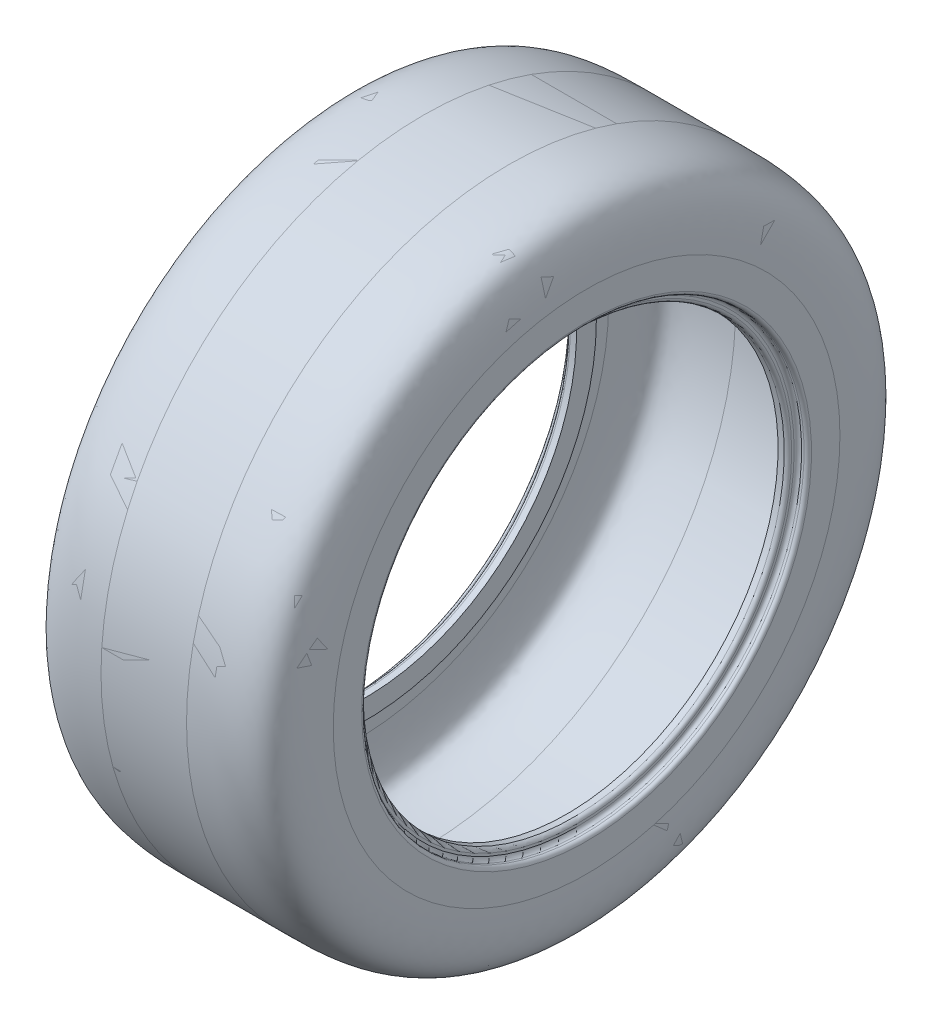
ISO-10303-21;
HEADER;
FILE_DESCRIPTION(('STEP AP214'),'2;1');
FILE_NAME('part.step','',(''),(''),'','','');
FILE_SCHEMA(('AUTOMOTIVE_DESIGN { 1 0 10303 214 1 1 1 1 }'));
ENDSEC;
DATA;
#1=APPLICATION_CONTEXT('core data for automotive mechanical design processes');
#2=APPLICATION_PROTOCOL_DEFINITION('international standard','automotive_design',2000,#1);
#3=PRODUCT_CONTEXT('',#1,'mechanical');
#4=PRODUCT('Part','Part','',(#3));
#5=PRODUCT_RELATED_PRODUCT_CATEGORY('part','',(#4));
#6=PRODUCT_DEFINITION_FORMATION('','',#4);
#7=PRODUCT_DEFINITION_CONTEXT('part definition',#1,'design');
#8=PRODUCT_DEFINITION('design','',#6,#7);
#9=PRODUCT_DEFINITION_SHAPE('','',#8);
#10=(LENGTH_UNIT() NAMED_UNIT(*) SI_UNIT(.MILLI.,.METRE.));
#11=(NAMED_UNIT(*) PLANE_ANGLE_UNIT() SI_UNIT($,.RADIAN.));
#12=(NAMED_UNIT(*) SI_UNIT($,.STERADIAN.) SOLID_ANGLE_UNIT());
#13=UNCERTAINTY_MEASURE_WITH_UNIT(LENGTH_MEASURE(1.E-05),#10,'distance_accuracy_value','');
#14=(GEOMETRIC_REPRESENTATION_CONTEXT(3) GLOBAL_UNCERTAINTY_ASSIGNED_CONTEXT((#13)) GLOBAL_UNIT_ASSIGNED_CONTEXT((#10,
#11,#12)) REPRESENTATION_CONTEXT('',''));
#15=CARTESIAN_POINT('',(0.,0.,0.));
#16=DIRECTION('',(0.,0.,1.));
#17=DIRECTION('',(1.,0.,0.));
#18=AXIS2_PLACEMENT_3D('',#15,#16,#17);
#19=CARTESIAN_POINT('',(34.544,260.35,0.));
#20=CARTESIAN_POINT('',(54.2380362782699,260.35,0.));
#21=CARTESIAN_POINT('',(96.8436791256326,260.294718787176,0.));
#22=CARTESIAN_POINT('',(97.409,229.201245204171,0.));
#23=CARTESIAN_POINT('',(97.409,204.6732,0.));
#24=B_SPLINE_CURVE_WITH_KNOTS('',3,(#19,#20,#21,#22,#23),.UNSPECIFIED.,.F.,.F.,(4,1,4),(0.,
0.500439370212607,1.),.UNSPECIFIED.);
#25=CARTESIAN_POINT('',(120.106742895568,0.,0.));
#26=DIRECTION('',(1.,0.,0.));
#27=AXIS1_PLACEMENT('',#25,#26);
#28=SURFACE_OF_REVOLUTION('',#24,#27);
#29=CARTESIAN_POINT('',(97.409,0.,0.));
#30=DIRECTION('',(-1.,0.,0.));
#31=DIRECTION('',(0.,0.,1.));
#32=AXIS2_PLACEMENT_3D('',#29,#30,#31);
#33=CIRCLE('',#32,204.6732);
#34=CARTESIAN_POINT('',(97.409,0.,204.6732));
#35=VERTEX_POINT('',#34);
#36=EDGE_CURVE('E11',#35,#35,#33,.T.);
#37=ORIENTED_EDGE('',*,*,#36,.T.);
#38=EDGE_LOOP('',(#37));
#39=FACE_BOUND('',#38,.T.);
#40=CARTESIAN_POINT('',(34.544,0.,0.));
#41=DIRECTION('',(-1.,0.,0.));
#42=DIRECTION('',(0.,0.,1.));
#43=AXIS2_PLACEMENT_3D('',#40,#41,#42);
#44=CIRCLE('',#43,260.35);
#45=CARTESIAN_POINT('',(34.544,0.,260.35));
#46=VERTEX_POINT('',#45);
#47=EDGE_CURVE('E51',#46,#46,#44,.T.);
#48=ORIENTED_EDGE('',*,*,#47,.F.);
#49=EDGE_LOOP('',(#48));
#50=FACE_BOUND('',#49,.T.);
#51=ADVANCED_FACE('F45',(#39,#50),#28,.T.);
#52=CARTESIAN_POINT('',(-120.106742895568,0.,0.));
#53=DIRECTION('',(-1.,0.,0.));
#54=DIRECTION('',(0.,0.,1.));
#55=AXIS2_PLACEMENT_3D('',#52,#53,#54);
#56=CYLINDRICAL_SURFACE('',#55,260.35);
#57=CARTESIAN_POINT('',(-34.544,0.,0.));
#58=DIRECTION('',(-1.,0.,0.));
#59=DIRECTION('',(0.,0.,1.));
#60=AXIS2_PLACEMENT_3D('',#57,#58,#59);
#61=CIRCLE('',#60,260.35);
#62=CARTESIAN_POINT('',(-34.544,0.,260.35));
#63=VERTEX_POINT('',#62);
#64=EDGE_CURVE('E59',#63,#63,#61,.T.);
#65=ORIENTED_EDGE('',*,*,#64,.F.);
#66=EDGE_LOOP('',(#65));
#67=FACE_BOUND('',#66,.T.);
#68=ORIENTED_EDGE('',*,*,#47,.T.);
#69=EDGE_LOOP('',(#68));
#70=FACE_BOUND('',#69,.T.);
#71=ADVANCED_FACE('F86',(#67,#70),#56,.T.);
#72=CARTESIAN_POINT('',(-34.544,260.35,0.));
#73=CARTESIAN_POINT('',(-54.2380362782699,260.35,0.));
#74=CARTESIAN_POINT('',(-96.8436791256326,260.294718787176,0.));
#75=CARTESIAN_POINT('',(-97.409,229.201245204171,0.));
#76=CARTESIAN_POINT('',(-97.409,204.6732,0.));
#77=B_SPLINE_CURVE_WITH_KNOTS('',3,(#72,#73,#74,#75,#76),.UNSPECIFIED.,.F.,.F.,(4,1,4),(0.,
0.500439370212607,1.),.UNSPECIFIED.);
#78=CARTESIAN_POINT('',(-120.106742895568,0.,0.));
#79=DIRECTION('',(-1.,0.,0.));
#80=AXIS1_PLACEMENT('',#78,#79);
#81=SURFACE_OF_REVOLUTION('',#77,#80);
#82=CARTESIAN_POINT('',(-97.409,0.,0.));
#83=DIRECTION('',(-1.,0.,0.));
#84=DIRECTION('',(0.,0.,1.));
#85=AXIS2_PLACEMENT_3D('',#82,#83,#84);
#86=CIRCLE('',#85,204.6732);
#87=CARTESIAN_POINT('',(-97.409,0.,204.6732));
#88=VERTEX_POINT('',#87);
#89=EDGE_CURVE('E65',#88,#88,#86,.T.);
#90=ORIENTED_EDGE('',*,*,#89,.F.);
#91=EDGE_LOOP('',(#90));
#92=FACE_BOUND('',#91,.T.);
#93=ORIENTED_EDGE('',*,*,#64,.T.);
#94=EDGE_LOOP('',(#93));
#95=FACE_BOUND('',#94,.T.);
#96=ADVANCED_FACE('F84',(#92,#95),#81,.T.);
#97=OPEN_SHELL('',(#51,#71,#96));
#98=SHELL_BASED_SURFACE_MODEL('B2',(#97));
#99=CARTESIAN_POINT('',(-120.106742895568,0.,0.));
#100=DIRECTION('',(-1.,0.,0.));
#101=DIRECTION('',(0.,0.,1.));
#102=AXIS2_PLACEMENT_3D('',#99,#100,#101);
#103=CYLINDRICAL_SURFACE('',#102,252.349);
#104=CARTESIAN_POINT('',(-34.544,0.,0.));
#105=DIRECTION('',(-1.,0.,0.));
#106=DIRECTION('',(0.,0.,1.));
#107=AXIS2_PLACEMENT_3D('',#104,#105,#106);
#108=CIRCLE('',#107,252.349);
#109=CARTESIAN_POINT('',(-34.544,0.,252.349));
#110=VERTEX_POINT('',#109);
#111=EDGE_CURVE('E183',#110,#110,#108,.T.);
#112=ORIENTED_EDGE('',*,*,#111,.T.);
#113=EDGE_LOOP('',(#112));
#114=FACE_BOUND('',#113,.T.);
#115=CARTESIAN_POINT('',(34.544,0.,0.));
#116=DIRECTION('',(-1.,0.,0.));
#117=DIRECTION('',(0.,0.,1.));
#118=AXIS2_PLACEMENT_3D('',#115,#116,#117);
#119=CIRCLE('',#118,252.349);
#120=CARTESIAN_POINT('',(34.544,0.,252.349));
#121=VERTEX_POINT('',#120);
#122=EDGE_CURVE('E208',#121,#121,#119,.T.);
#123=ORIENTED_EDGE('',*,*,#122,.F.);
#124=EDGE_LOOP('',(#123));
#125=FACE_BOUND('',#124,.T.);
#126=ADVANCED_FACE('F129',(#114,#125),#103,.F.);
#127=CARTESIAN_POINT('',(-89.408,204.6732,0.));
#128=CARTESIAN_POINT('',(-89.408,205.428511481488,0.));
#129=CARTESIAN_POINT('',(-89.4074481294099,206.953602566111,0.));
#130=CARTESIAN_POINT('',(-89.4016722170661,209.888037484535,0.));
#131=CARTESIAN_POINT('',(-89.3811140265898,213.418121805844,0.));
#132=CARTESIAN_POINT('',(-89.3208009929498,217.405548766125,0.));
#133=CARTESIAN_POINT('',(-89.1749069460033,222.394259863428,0.));
#134=CARTESIAN_POINT('',(-88.8373919387541,227.999934294238,0.));
#135=CARTESIAN_POINT('',(-88.1026678709484,233.669585183806,0.));
#136=CARTESIAN_POINT('',(-87.0031069794399,238.226642631209,0.));
#137=CARTESIAN_POINT('',(-85.5795715018578,241.661292123052,0.));
#138=CARTESIAN_POINT('',(-83.9698243004832,244.024418961103,0.));
#139=CARTESIAN_POINT('',(-82.3680542692465,245.565614045219,0.));
#140=CARTESIAN_POINT('',(-80.6182199791964,246.772714256692,0.));
#141=CARTESIAN_POINT('',(-78.2236283903669,248.033037193223,0.));
#142=CARTESIAN_POINT('',(-74.4012841407882,249.412831370225,0.));
#143=CARTESIAN_POINT('',(-69.0966623406285,250.616677169545,0.));
#144=CARTESIAN_POINT('',(-60.9755730997374,251.743940548168,0.));
#145=CARTESIAN_POINT('',(-51.6939864079942,252.224589007201,0.));
#146=CARTESIAN_POINT('',(-41.9379015529832,252.347933269659,0.));
#147=CARTESIAN_POINT('',(-37.0039834879832,252.349,0.));
#148=CARTESIAN_POINT('',(-34.544,252.349,0.));
#149=B_SPLINE_CURVE_WITH_KNOTS('',3,(#127,#128,#129,#130,#131,#132,#133,#134,#135,#136,#137,
#138,#139,#140,#141,#142,#143,#144,#145,#146,#147,#148),.UNSPECIFIED.,.F.,.F.,(4,1,1,1,1,1,1,1,
1,1,1,1,1,1,1,1,1,1,1,4),(0.,0.015625,0.03125,0.0625,0.09375,0.125,0.1875,0.25,0.3125,0.375,
0.4375,0.490405543441297,0.521655543441297,0.5625,0.625,0.6875,0.75,0.875,0.9375,1.),.UNSPECIFIED.);
#150=CARTESIAN_POINT('',(-120.106742895568,0.,0.));
#151=DIRECTION('',(-1.,0.,0.));
#152=AXIS1_PLACEMENT('',#150,#151);
#153=SURFACE_OF_REVOLUTION('',#149,#152);
#154=ORIENTED_EDGE('',*,*,#111,.F.);
#155=EDGE_LOOP('',(#154));
#156=FACE_BOUND('',#155,.T.);
#157=CARTESIAN_POINT('',(-89.408,0.,0.));
#158=DIRECTION('',(-1.,0.,0.));
#159=DIRECTION('',(0.,0.,1.));
#160=AXIS2_PLACEMENT_3D('',#157,#158,#159);
#161=CIRCLE('',#160,204.6732);
#162=CARTESIAN_POINT('',(-89.408,0.,204.6732));
#163=VERTEX_POINT('',#162);
#164=EDGE_CURVE('E187',#163,#163,#161,.T.);
#165=ORIENTED_EDGE('',*,*,#164,.T.);
#166=EDGE_LOOP('',(#165));
#167=FACE_BOUND('',#166,.T.);
#168=ADVANCED_FACE('F221',(#156,#167),#153,.T.);
#169=CARTESIAN_POINT('',(-89.408,186.69,0.));
#170=DIRECTION('',(-1.,0.,0.));
#171=DIRECTION('',(0.,0.,1.));
#172=AXIS2_PLACEMENT_3D('',#169,#170,#171);
#173=PLANE('',#172);
#174=ORIENTED_EDGE('',*,*,#164,.F.);
#175=EDGE_LOOP('',(#174));
#176=FACE_BOUND('',#175,.T.);
#177=CARTESIAN_POINT('',(-89.408,0.,0.));
#178=DIRECTION('',(-1.,0.,0.));
#179=DIRECTION('',(0.,0.,1.));
#180=AXIS2_PLACEMENT_3D('',#177,#178,#179);
#181=CIRCLE('',#180,186.69);
#182=CARTESIAN_POINT('',(-89.408,0.,186.69));
#183=VERTEX_POINT('',#182);
#184=EDGE_CURVE('E191',#183,#183,#181,.T.);
#185=ORIENTED_EDGE('',*,*,#184,.T.);
#186=EDGE_LOOP('',(#185));
#187=FACE_BOUND('',#186,.T.);
#188=ADVANCED_FACE('F225',(#176,#187),#173,.F.);
#189=CARTESIAN_POINT('',(-120.106742895568,0.,0.));
#190=DIRECTION('',(-1.,0.,0.));
#191=DIRECTION('',(0.,0.,1.));
#192=AXIS2_PLACEMENT_3D('',#189,#190,#191);
#193=CYLINDRICAL_SURFACE('',#192,186.69);
#194=ORIENTED_EDGE('',*,*,#184,.F.);
#195=EDGE_LOOP('',(#194));
#196=FACE_BOUND('',#195,.T.);
#197=CARTESIAN_POINT('',(-81.407,0.,0.));
#198=DIRECTION('',(-1.,0.,0.));
#199=DIRECTION('',(0.,0.,1.));
#200=AXIS2_PLACEMENT_3D('',#197,#198,#199);
#201=CIRCLE('',#200,186.69);
#202=CARTESIAN_POINT('',(-81.407,0.,186.69));
#203=VERTEX_POINT('',#202);
#204=EDGE_CURVE('E194',#203,#203,#201,.T.);
#205=ORIENTED_EDGE('',*,*,#204,.T.);
#206=EDGE_LOOP('',(#205));
#207=FACE_BOUND('',#206,.T.);
#208=ADVANCED_FACE('F357',(#196,#207),#193,.T.);
#209=CARTESIAN_POINT('',(-81.407,178.689,0.));
#210=DIRECTION('',(-1.,0.,0.));
#211=DIRECTION('',(0.,0.,1.));
#212=AXIS2_PLACEMENT_3D('',#209,#210,#211);
#213=PLANE('',#212);
#214=ORIENTED_EDGE('',*,*,#204,.F.);
#215=EDGE_LOOP('',(#214));
#216=FACE_BOUND('',#215,.T.);
#217=CARTESIAN_POINT('',(-81.407,0.,0.));
#218=DIRECTION('',(-1.,0.,0.));
#219=DIRECTION('',(0.,0.,1.));
#220=AXIS2_PLACEMENT_3D('',#217,#218,#219);
#221=CIRCLE('',#220,170.688);
#222=CARTESIAN_POINT('',(-81.407,0.,170.688));
#223=VERTEX_POINT('',#222);
#224=EDGE_CURVE('E197',#223,#223,#221,.T.);
#225=ORIENTED_EDGE('',*,*,#224,.T.);
#226=EDGE_LOOP('',(#225));
#227=FACE_BOUND('',#226,.T.);
#228=ADVANCED_FACE('F364',(#216,#227),#213,.F.);
#229=CARTESIAN_POINT('',(-120.106742895568,0.,0.));
#230=DIRECTION('',(-1.,0.,0.));
#231=DIRECTION('',(0.,0.,1.));
#232=AXIS2_PLACEMENT_3D('',#229,#230,#231);
#233=CYLINDRICAL_SURFACE('',#232,170.688);
#234=CARTESIAN_POINT('',(-86.4108,0.,0.));
#235=DIRECTION('',(1.,0.,0.));
#236=DIRECTION('',(0.,0.,-1.));
#237=AXIS2_PLACEMENT_3D('',#234,#235,#236);
#238=CIRCLE('',#237,170.688);
#239=CARTESIAN_POINT('',(-86.4108,0.,-170.688));
#240=VERTEX_POINT('',#239);
#241=EDGE_CURVE('E165',#240,#240,#238,.F.);
#242=ORIENTED_EDGE('',*,*,#241,.T.);
#243=EDGE_LOOP('',(#242));
#244=FACE_BOUND('',#243,.T.);
#245=ORIENTED_EDGE('',*,*,#224,.F.);
#246=EDGE_LOOP('',(#245));
#247=FACE_BOUND('',#246,.T.);
#248=ADVANCED_FACE('F371',(#244,#247),#233,.F.);
#249=CARTESIAN_POINT('',(-89.408,170.688,0.));
#250=DIRECTION('',(1.,0.,0.));
#251=DIRECTION('',(0.,0.,-1.));
#252=AXIS2_PLACEMENT_3D('',#249,#250,#251);
#253=PLANE('',#252);
#254=CARTESIAN_POINT('',(-89.408,0.,0.));
#255=DIRECTION('',(1.,0.,0.));
#256=DIRECTION('',(0.,0.,-1.));
#257=AXIS2_PLACEMENT_3D('',#254,#255,#256);
#258=CIRCLE('',#257,175.6918);
#259=CARTESIAN_POINT('',(-89.408,0.,-175.6918));
#260=VERTEX_POINT('',#259);
#261=EDGE_CURVE('E177',#260,#260,#258,.F.);
#262=ORIENTED_EDGE('',*,*,#261,.T.);
#263=EDGE_LOOP('',(#262));
#264=FACE_BOUND('',#263,.T.);
#265=CARTESIAN_POINT('',(-89.408,0.,0.));
#266=DIRECTION('',(1.,0.,0.));
#267=DIRECTION('',(0.,0.,-1.));
#268=AXIS2_PLACEMENT_3D('',#265,#266,#267);
#269=CIRCLE('',#268,173.6852);
#270=CARTESIAN_POINT('',(-89.408,0.,-173.6852));
#271=VERTEX_POINT('',#270);
#272=EDGE_CURVE('E180',#271,#271,#269,.T.);
#273=ORIENTED_EDGE('',*,*,#272,.T.);
#274=EDGE_LOOP('',(#273));
#275=FACE_BOUND('',#274,.T.);
#276=ADVANCED_FACE('F380',(#264,#275),#253,.F.);
#277=CARTESIAN_POINT('',(-120.106742895568,0.,0.));
#278=DIRECTION('',(-1.,0.,0.));
#279=DIRECTION('',(0.,0.,1.));
#280=AXIS2_PLACEMENT_3D('',#277,#278,#279);
#281=CYLINDRICAL_SURFACE('',#280,178.689);
#282=CARTESIAN_POINT('',(-92.4052,0.,0.));
#283=DIRECTION('',(1.,0.,0.));
#284=DIRECTION('',(0.,0.,-1.));
#285=AXIS2_PLACEMENT_3D('',#282,#283,#284);
#286=CIRCLE('',#285,178.689);
#287=CARTESIAN_POINT('',(-92.4052,0.,-178.689));
#288=VERTEX_POINT('',#287);
#289=EDGE_CURVE('E171',#288,#288,#286,.T.);
#290=ORIENTED_EDGE('',*,*,#289,.T.);
#291=EDGE_LOOP('',(#290));
#292=FACE_BOUND('',#291,.T.);
#293=CARTESIAN_POINT('',(-94.4118,0.,0.));
#294=DIRECTION('',(1.,0.,0.));
#295=DIRECTION('',(0.,0.,-1.));
#296=AXIS2_PLACEMENT_3D('',#293,#294,#295);
#297=CIRCLE('',#296,178.689);
#298=CARTESIAN_POINT('',(-94.4118,0.,-178.689));
#299=VERTEX_POINT('',#298);
#300=EDGE_CURVE('E174',#299,#299,#297,.F.);
#301=ORIENTED_EDGE('',*,*,#300,.T.);
#302=EDGE_LOOP('',(#301));
#303=FACE_BOUND('',#302,.T.);
#304=ADVANCED_FACE('F388',(#292,#303),#281,.F.);
#305=CARTESIAN_POINT('',(-97.409,178.689,0.));
#306=DIRECTION('',(1.,0.,0.));
#307=DIRECTION('',(0.,0.,-1.));
#308=AXIS2_PLACEMENT_3D('',#305,#306,#307);
#309=PLANE('',#308);
#310=CARTESIAN_POINT('',(-97.409,0.,0.));
#311=DIRECTION('',(1.,0.,0.));
#312=DIRECTION('',(0.,0.,-1.));
#313=AXIS2_PLACEMENT_3D('',#310,#311,#312);
#314=CIRCLE('',#313,181.6862);
#315=CARTESIAN_POINT('',(-97.409,0.,-181.6862));
#316=VERTEX_POINT('',#315);
#317=EDGE_CURVE('E168',#316,#316,#314,.T.);
#318=ORIENTED_EDGE('',*,*,#317,.T.);
#319=EDGE_LOOP('',(#318));
#320=FACE_BOUND('',#319,.T.);
#321=CARTESIAN_POINT('',(-97.409,0.,0.));
#322=DIRECTION('',(-1.,0.,0.));
#323=DIRECTION('',(0.,0.,1.));
#324=AXIS2_PLACEMENT_3D('',#321,#322,#323);
#325=CIRCLE('',#324,204.6732);
#326=CARTESIAN_POINT('',(-97.409,0.,204.6732));
#327=VERTEX_POINT('',#326);
#328=EDGE_CURVE('E200',#327,#327,#325,.T.);
#329=ORIENTED_EDGE('',*,*,#328,.T.);
#330=EDGE_LOOP('',(#329));
#331=FACE_BOUND('',#330,.T.);
#332=ADVANCED_FACE('F396',(#320,#331),#309,.F.);
#333=CARTESIAN_POINT('',(-34.544,260.35,0.));
#334=CARTESIAN_POINT('',(-54.2380362782699,260.35,0.));
#335=CARTESIAN_POINT('',(-96.8436791256326,260.294718787176,0.));
#336=CARTESIAN_POINT('',(-97.409,229.201245204171,0.));
#337=CARTESIAN_POINT('',(-97.409,204.6732,0.));
#338=B_SPLINE_CURVE_WITH_KNOTS('',3,(#333,#334,#335,#336,#337),.UNSPECIFIED.,.F.,.F.,(4,1,4),
(0.,0.500439370212607,1.),.UNSPECIFIED.);
#339=CARTESIAN_POINT('',(-120.106742895568,0.,0.));
#340=DIRECTION('',(-1.,0.,0.));
#341=AXIS1_PLACEMENT('',#339,#340);
#342=SURFACE_OF_REVOLUTION('',#338,#341);
#343=ORIENTED_EDGE('',*,*,#328,.F.);
#344=EDGE_LOOP('',(#343));
#345=FACE_BOUND('',#344,.T.);
#346=CARTESIAN_POINT('',(-34.544,0.,0.));
#347=DIRECTION('',(-1.,0.,0.));
#348=DIRECTION('',(0.,0.,1.));
#349=AXIS2_PLACEMENT_3D('',#346,#347,#348);
#350=CIRCLE('',#349,260.35);
#351=CARTESIAN_POINT('',(-34.544,0.,260.35));
#352=VERTEX_POINT('',#351);
#353=EDGE_CURVE('E204',#352,#352,#350,.T.);
#354=ORIENTED_EDGE('',*,*,#353,.T.);
#355=EDGE_LOOP('',(#354));
#356=FACE_BOUND('',#355,.T.);
#357=ADVANCED_FACE('F405',(#345,#356),#342,.T.);
#358=CARTESIAN_POINT('',(-120.106742895568,0.,0.));
#359=DIRECTION('',(-1.,0.,0.));
#360=DIRECTION('',(0.,0.,1.));
#361=AXIS2_PLACEMENT_3D('',#358,#359,#360);
#362=CYLINDRICAL_SURFACE('',#361,260.35);
#363=ORIENTED_EDGE('',*,*,#353,.F.);
#364=EDGE_LOOP('',(#363));
#365=FACE_BOUND('',#364,.T.);
#366=CARTESIAN_POINT('',(34.544,0.,0.));
#367=DIRECTION('',(-1.,0.,0.));
#368=DIRECTION('',(0.,0.,1.));
#369=AXIS2_PLACEMENT_3D('',#366,#367,#368);
#370=CIRCLE('',#369,260.35);
#371=CARTESIAN_POINT('',(34.544,0.,260.35));
#372=VERTEX_POINT('',#371);
#373=EDGE_CURVE('E300',#372,#372,#370,.T.);
#374=ORIENTED_EDGE('',*,*,#373,.T.);
#375=EDGE_LOOP('',(#374));
#376=FACE_BOUND('',#375,.T.);
#377=ADVANCED_FACE('F235',(#365,#376),#362,.T.);
#378=CARTESIAN_POINT('',(-92.4052,0.,0.));
#379=DIRECTION('',(1.,0.,0.));
#380=DIRECTION('',(0.,0.,-1.));
#381=AXIS2_PLACEMENT_3D('',#378,#379,#380);
#382=TOROIDAL_SURFACE('',#381,175.6918,2.9972);
#383=ORIENTED_EDGE('',*,*,#289,.F.);
#384=EDGE_LOOP('',(#383));
#385=FACE_BOUND('',#384,.T.);
#386=ORIENTED_EDGE('',*,*,#261,.F.);
#387=EDGE_LOOP('',(#386));
#388=FACE_BOUND('',#387,.T.);
#389=ADVANCED_FACE('F231',(#385,#388),#382,.F.);
#390=CARTESIAN_POINT('',(-94.4118,0.,0.));
#391=DIRECTION('',(1.,0.,0.));
#392=DIRECTION('',(0.,0.,-1.));
#393=AXIS2_PLACEMENT_3D('',#390,#391,#392);
#394=TOROIDAL_SURFACE('',#393,181.6862,2.9972);
#395=ORIENTED_EDGE('',*,*,#317,.F.);
#396=EDGE_LOOP('',(#395));
#397=FACE_BOUND('',#396,.T.);
#398=ORIENTED_EDGE('',*,*,#300,.F.);
#399=EDGE_LOOP('',(#398));
#400=FACE_BOUND('',#399,.T.);
#401=ADVANCED_FACE('F234',(#397,#400),#394,.T.);
#402=CARTESIAN_POINT('',(-86.4108,0.,0.));
#403=DIRECTION('',(1.,0.,0.));
#404=DIRECTION('',(0.,0.,-1.));
#405=AXIS2_PLACEMENT_3D('',#402,#403,#404);
#406=TOROIDAL_SURFACE('',#405,173.6852,2.9972);
#407=ORIENTED_EDGE('',*,*,#272,.F.);
#408=EDGE_LOOP('',(#407));
#409=FACE_BOUND('',#408,.T.);
#410=ORIENTED_EDGE('',*,*,#241,.F.);
#411=EDGE_LOOP('',(#410));
#412=FACE_BOUND('',#411,.T.);
#413=ADVANCED_FACE('F239',(#409,#412),#406,.T.);
#414=CARTESIAN_POINT('',(89.408,204.6732,0.));
#415=CARTESIAN_POINT('',(89.408,205.428511481488,0.));
#416=CARTESIAN_POINT('',(89.4074481294099,206.953602566111,0.));
#417=CARTESIAN_POINT('',(89.4016722170661,209.888037484535,0.));
#418=CARTESIAN_POINT('',(89.3811140265898,213.418121805844,0.));
#419=CARTESIAN_POINT('',(89.3208009929498,217.405548766125,0.));
#420=CARTESIAN_POINT('',(89.1749069460033,222.394259863428,0.));
#421=CARTESIAN_POINT('',(88.8373919387541,227.999934294238,0.));
#422=CARTESIAN_POINT('',(88.1026678709484,233.669585183806,0.));
#423=CARTESIAN_POINT('',(87.0031069794399,238.226642631209,0.));
#424=CARTESIAN_POINT('',(85.5795715018578,241.661292123052,0.));
#425=CARTESIAN_POINT('',(83.9698243004832,244.024418961103,0.));
#426=CARTESIAN_POINT('',(82.3680542692465,245.565614045219,0.));
#427=CARTESIAN_POINT('',(80.6182199791964,246.772714256692,0.));
#428=CARTESIAN_POINT('',(78.2236283903669,248.033037193223,0.));
#429=CARTESIAN_POINT('',(74.4012841407882,249.412831370225,0.));
#430=CARTESIAN_POINT('',(69.0966623406285,250.616677169545,0.));
#431=CARTESIAN_POINT('',(60.9755730997374,251.743940548168,0.));
#432=CARTESIAN_POINT('',(51.6939864079942,252.224589007201,0.));
#433=CARTESIAN_POINT('',(41.9379015529832,252.347933269659,0.));
#434=CARTESIAN_POINT('',(37.0039834879832,252.349,0.));
#435=CARTESIAN_POINT('',(34.544,252.349,0.));
#436=B_SPLINE_CURVE_WITH_KNOTS('',3,(#414,#415,#416,#417,#418,#419,#420,#421,#422,#423,#424,
#425,#426,#427,#428,#429,#430,#431,#432,#433,#434,#435),.UNSPECIFIED.,.F.,.F.,(4,1,1,1,1,1,1,1,
1,1,1,1,1,1,1,1,1,1,1,4),(0.,0.015625,0.03125,0.0625,0.09375,0.125,0.1875,0.25,0.3125,0.375,
0.4375,0.490405543441297,0.521655543441297,0.5625,0.625,0.6875,0.75,0.875,0.9375,1.),.UNSPECIFIED.);
#437=CARTESIAN_POINT('',(120.106742895568,0.,0.));
#438=DIRECTION('',(1.,0.,0.));
#439=AXIS1_PLACEMENT('',#437,#438);
#440=SURFACE_OF_REVOLUTION('',#436,#439);
#441=ORIENTED_EDGE('',*,*,#122,.T.);
#442=EDGE_LOOP('',(#441));
#443=FACE_BOUND('',#442,.T.);
#444=CARTESIAN_POINT('',(89.408,0.,0.));
#445=DIRECTION('',(-1.,0.,0.));
#446=DIRECTION('',(0.,0.,1.));
#447=AXIS2_PLACEMENT_3D('',#444,#445,#446);
#448=CIRCLE('',#447,204.6732);
#449=CARTESIAN_POINT('',(89.408,0.,204.6732));
#450=VERTEX_POINT('',#449);
#451=EDGE_CURVE('E321',#450,#450,#448,.T.);
#452=ORIENTED_EDGE('',*,*,#451,.F.);
#453=EDGE_LOOP('',(#452));
#454=FACE_BOUND('',#453,.T.);
#455=ADVANCED_FACE('F243',(#443,#454),#440,.T.);
#456=CARTESIAN_POINT('',(89.408,186.69,0.));
#457=DIRECTION('',(1.,0.,0.));
#458=DIRECTION('',(0.,0.,1.));
#459=AXIS2_PLACEMENT_3D('',#456,#457,#458);
#460=PLANE('',#459);
#461=ORIENTED_EDGE('',*,*,#451,.T.);
#462=EDGE_LOOP('',(#461));
#463=FACE_BOUND('',#462,.T.);
#464=CARTESIAN_POINT('',(89.408,0.,0.));
#465=DIRECTION('',(-1.,0.,0.));
#466=DIRECTION('',(0.,0.,1.));
#467=AXIS2_PLACEMENT_3D('',#464,#465,#466);
#468=CIRCLE('',#467,186.69);
#469=CARTESIAN_POINT('',(89.408,0.,186.69));
#470=VERTEX_POINT('',#469);
#471=EDGE_CURVE('E317',#470,#470,#468,.T.);
#472=ORIENTED_EDGE('',*,*,#471,.F.);
#473=EDGE_LOOP('',(#472));
#474=FACE_BOUND('',#473,.T.);
#475=ADVANCED_FACE('F282',(#463,#474),#460,.F.);
#476=CARTESIAN_POINT('',(120.106742895568,0.,0.));
#477=DIRECTION('',(1.,0.,0.));
#478=DIRECTION('',(0.,0.,1.));
#479=AXIS2_PLACEMENT_3D('',#476,#477,#478);
#480=CYLINDRICAL_SURFACE('',#479,186.69);
#481=ORIENTED_EDGE('',*,*,#471,.T.);
#482=EDGE_LOOP('',(#481));
#483=FACE_BOUND('',#482,.T.);
#484=CARTESIAN_POINT('',(81.407,0.,0.));
#485=DIRECTION('',(-1.,0.,0.));
#486=DIRECTION('',(0.,0.,1.));
#487=AXIS2_PLACEMENT_3D('',#484,#485,#486);
#488=CIRCLE('',#487,186.69);
#489=CARTESIAN_POINT('',(81.407,0.,186.69));
#490=VERTEX_POINT('',#489);
#491=EDGE_CURVE('E314',#490,#490,#488,.T.);
#492=ORIENTED_EDGE('',*,*,#491,.F.);
#493=EDGE_LOOP('',(#492));
#494=FACE_BOUND('',#493,.T.);
#495=ADVANCED_FACE('F278',(#483,#494),#480,.T.);
#496=CARTESIAN_POINT('',(81.407,178.689,0.));
#497=DIRECTION('',(1.,0.,0.));
#498=DIRECTION('',(0.,0.,1.));
#499=AXIS2_PLACEMENT_3D('',#496,#497,#498);
#500=PLANE('',#499);
#501=ORIENTED_EDGE('',*,*,#491,.T.);
#502=EDGE_LOOP('',(#501));
#503=FACE_BOUND('',#502,.T.);
#504=CARTESIAN_POINT('',(81.407,0.,0.));
#505=DIRECTION('',(-1.,0.,0.));
#506=DIRECTION('',(0.,0.,1.));
#507=AXIS2_PLACEMENT_3D('',#504,#505,#506);
#508=CIRCLE('',#507,170.688);
#509=CARTESIAN_POINT('',(81.407,0.,170.688));
#510=VERTEX_POINT('',#509);
#511=EDGE_CURVE('E310',#510,#510,#508,.T.);
#512=ORIENTED_EDGE('',*,*,#511,.F.);
#513=EDGE_LOOP('',(#512));
#514=FACE_BOUND('',#513,.T.);
#515=ADVANCED_FACE('F271',(#503,#514),#500,.F.);
#516=CARTESIAN_POINT('',(120.106742895568,0.,0.));
#517=DIRECTION('',(1.,0.,0.));
#518=DIRECTION('',(0.,0.,1.));
#519=AXIS2_PLACEMENT_3D('',#516,#517,#518);
#520=CYLINDRICAL_SURFACE('',#519,170.688);
#521=CARTESIAN_POINT('',(86.4108,0.,0.));
#522=DIRECTION('',(-1.,0.,0.));
#523=DIRECTION('',(0.,0.,1.));
#524=AXIS2_PLACEMENT_3D('',#521,#522,#523);
#525=CIRCLE('',#524,170.688);
#526=CARTESIAN_POINT('',(86.4108,0.,170.688));
#527=VERTEX_POINT('',#526);
#528=EDGE_CURVE('E152',#527,#527,#525,.F.);
#529=ORIENTED_EDGE('',*,*,#528,.T.);
#530=EDGE_LOOP('',(#529));
#531=FACE_BOUND('',#530,.T.);
#532=ORIENTED_EDGE('',*,*,#511,.T.);
#533=EDGE_LOOP('',(#532));
#534=FACE_BOUND('',#533,.T.);
#535=ADVANCED_FACE('F262',(#531,#534),#520,.F.);
#536=CARTESIAN_POINT('',(89.408,170.688,0.));
#537=DIRECTION('',(-1.,0.,0.));
#538=DIRECTION('',(0.,0.,-1.));
#539=AXIS2_PLACEMENT_3D('',#536,#537,#538);
#540=PLANE('',#539);
#541=CARTESIAN_POINT('',(89.408,0.,0.));
#542=DIRECTION('',(-1.,0.,0.));
#543=DIRECTION('',(0.,0.,1.));
#544=AXIS2_PLACEMENT_3D('',#541,#542,#543);
#545=CIRCLE('',#544,173.6852);
#546=CARTESIAN_POINT('',(89.408,0.,173.6852));
#547=VERTEX_POINT('',#546);
#548=EDGE_CURVE('E157',#547,#547,#545,.T.);
#549=ORIENTED_EDGE('',*,*,#548,.T.);
#550=EDGE_LOOP('',(#549));
#551=FACE_BOUND('',#550,.T.);
#552=CARTESIAN_POINT('',(89.408,0.,0.));
#553=DIRECTION('',(-1.,0.,0.));
#554=DIRECTION('',(0.,0.,1.));
#555=AXIS2_PLACEMENT_3D('',#552,#553,#554);
#556=CIRCLE('',#555,175.6918);
#557=CARTESIAN_POINT('',(89.408,0.,175.6918));
#558=VERTEX_POINT('',#557);
#559=EDGE_CURVE('E161',#558,#558,#556,.F.);
#560=ORIENTED_EDGE('',*,*,#559,.T.);
#561=EDGE_LOOP('',(#560));
#562=FACE_BOUND('',#561,.T.);
#563=ADVANCED_FACE('F259',(#551,#562),#540,.F.);
#564=CARTESIAN_POINT('',(120.106742895568,0.,0.));
#565=DIRECTION('',(1.,0.,0.));
#566=DIRECTION('',(0.,0.,1.));
#567=AXIS2_PLACEMENT_3D('',#564,#565,#566);
#568=CYLINDRICAL_SURFACE('',#567,178.689);
#569=CARTESIAN_POINT('',(92.4052,0.,0.));
#570=DIRECTION('',(-1.,0.,0.));
#571=DIRECTION('',(0.,0.,1.));
#572=AXIS2_PLACEMENT_3D('',#569,#570,#571);
#573=CIRCLE('',#572,178.689);
#574=CARTESIAN_POINT('',(92.4052,0.,178.689));
#575=VERTEX_POINT('',#574);
#576=EDGE_CURVE('E137',#575,#575,#573,.T.);
#577=ORIENTED_EDGE('',*,*,#576,.T.);
#578=EDGE_LOOP('',(#577));
#579=FACE_BOUND('',#578,.T.);
#580=CARTESIAN_POINT('',(94.4118,0.,0.));
#581=DIRECTION('',(-1.,0.,0.));
#582=DIRECTION('',(0.,0.,1.));
#583=AXIS2_PLACEMENT_3D('',#580,#581,#582);
#584=CIRCLE('',#583,178.689);
#585=CARTESIAN_POINT('',(94.4118,0.,178.689));
#586=VERTEX_POINT('',#585);
#587=EDGE_CURVE('E145',#586,#586,#584,.F.);
#588=ORIENTED_EDGE('',*,*,#587,.T.);
#589=EDGE_LOOP('',(#588));
#590=FACE_BOUND('',#589,.T.);
#591=ADVANCED_FACE('F261',(#579,#590),#568,.F.);
#592=CARTESIAN_POINT('',(97.409,178.689,0.));
#593=DIRECTION('',(-1.,0.,0.));
#594=DIRECTION('',(0.,0.,-1.));
#595=AXIS2_PLACEMENT_3D('',#592,#593,#594);
#596=PLANE('',#595);
#597=CARTESIAN_POINT('',(97.409,0.,0.));
#598=DIRECTION('',(-1.,0.,0.));
#599=DIRECTION('',(0.,0.,1.));
#600=AXIS2_PLACEMENT_3D('',#597,#598,#599);
#601=CIRCLE('',#600,181.6862);
#602=CARTESIAN_POINT('',(97.409,0.,181.6862));
#603=VERTEX_POINT('',#602);
#604=EDGE_CURVE('E44',#603,#603,#601,.T.);
#605=ORIENTED_EDGE('',*,*,#604,.T.);
#606=EDGE_LOOP('',(#605));
#607=FACE_BOUND('',#606,.T.);
#608=CARTESIAN_POINT('',(97.409,0.,0.));
#609=DIRECTION('',(-1.,0.,0.));
#610=DIRECTION('',(0.,0.,1.));
#611=AXIS2_PLACEMENT_3D('',#608,#609,#610);
#612=CIRCLE('',#611,204.6732);
#613=CARTESIAN_POINT('',(97.409,0.,204.6732));
#614=VERTEX_POINT('',#613);
#615=EDGE_CURVE('E307',#614,#614,#612,.T.);
#616=ORIENTED_EDGE('',*,*,#615,.F.);
#617=EDGE_LOOP('',(#616));
#618=FACE_BOUND('',#617,.T.);
#619=ADVANCED_FACE('F269',(#607,#618),#596,.F.);
#620=CARTESIAN_POINT('',(34.544,260.35,0.));
#621=CARTESIAN_POINT('',(54.2380362782699,260.35,0.));
#622=CARTESIAN_POINT('',(96.8436791256326,260.294718787176,0.));
#623=CARTESIAN_POINT('',(97.409,229.201245204171,0.));
#624=CARTESIAN_POINT('',(97.409,204.6732,0.));
#625=B_SPLINE_CURVE_WITH_KNOTS('',3,(#620,#621,#622,#623,#624),.UNSPECIFIED.,.F.,.F.,(4,1,4),
(0.,0.500439370212607,1.),.UNSPECIFIED.);
#626=CARTESIAN_POINT('',(120.106742895568,0.,0.));
#627=DIRECTION('',(1.,0.,0.));
#628=AXIS1_PLACEMENT('',#626,#627);
#629=SURFACE_OF_REVOLUTION('',#625,#628);
#630=ORIENTED_EDGE('',*,*,#615,.T.);
#631=EDGE_LOOP('',(#630));
#632=FACE_BOUND('',#631,.T.);
#633=ORIENTED_EDGE('',*,*,#373,.F.);
#634=EDGE_LOOP('',(#633));
#635=FACE_BOUND('',#634,.T.);
#636=ADVANCED_FACE('F248',(#632,#635),#629,.T.);
#637=CARTESIAN_POINT('',(86.4108,0.,0.));
#638=DIRECTION('',(-1.,0.,0.));
#639=DIRECTION('',(0.,0.,1.));
#640=AXIS2_PLACEMENT_3D('',#637,#638,#639);
#641=TOROIDAL_SURFACE('',#640,173.6852,2.9972);
#642=ORIENTED_EDGE('',*,*,#528,.F.);
#643=EDGE_LOOP('',(#642));
#644=FACE_BOUND('',#643,.T.);
#645=ORIENTED_EDGE('',*,*,#548,.F.);
#646=EDGE_LOOP('',(#645));
#647=FACE_BOUND('',#646,.T.);
#648=ADVANCED_FACE('F245',(#644,#647),#641,.T.);
#649=CARTESIAN_POINT('',(92.4052,0.,0.));
#650=DIRECTION('',(-1.,0.,0.));
#651=DIRECTION('',(0.,0.,1.));
#652=AXIS2_PLACEMENT_3D('',#649,#650,#651);
#653=TOROIDAL_SURFACE('',#652,175.6918,2.9972);
#654=ORIENTED_EDGE('',*,*,#559,.F.);
#655=EDGE_LOOP('',(#654));
#656=FACE_BOUND('',#655,.T.);
#657=ORIENTED_EDGE('',*,*,#576,.F.);
#658=EDGE_LOOP('',(#657));
#659=FACE_BOUND('',#658,.T.);
#660=ADVANCED_FACE('F247',(#656,#659),#653,.F.);
#661=CARTESIAN_POINT('',(94.4118,0.,0.));
#662=DIRECTION('',(-1.,0.,0.));
#663=DIRECTION('',(0.,0.,1.));
#664=AXIS2_PLACEMENT_3D('',#661,#662,#663);
#665=TOROIDAL_SURFACE('',#664,181.6862,2.9972);
#666=ORIENTED_EDGE('',*,*,#587,.F.);
#667=EDGE_LOOP('',(#666));
#668=FACE_BOUND('',#667,.T.);
#669=ORIENTED_EDGE('',*,*,#604,.F.);
#670=EDGE_LOOP('',(#669));
#671=FACE_BOUND('',#670,.T.);
#672=ADVANCED_FACE('F131',(#668,#671),#665,.T.);
#673=CLOSED_SHELL('',(#126,#168,#188,#208,#228,#248,#276,#304,#332,#357,#377,#389,#401,#413,
#455,#475,#495,#515,#535,#563,#591,#619,#636,#648,#660,#672));
#674=MANIFOLD_SOLID_BREP('B6',#673);
#675=ADVANCED_BREP_SHAPE_REPRESENTATION('',(#18,#674),#14);
#676=MANIFOLD_SURFACE_SHAPE_REPRESENTATION('',(#18,#98),#14);
#677=SHAPE_REPRESENTATION('',(#18),#14);
#678=SHAPE_DEFINITION_REPRESENTATION(#9,#677);
#679=SHAPE_REPRESENTATION_RELATIONSHIP('','',#677,#675);
#680=SHAPE_REPRESENTATION_RELATIONSHIP('','',#677,#676);
ENDSEC;
END-ISO-10303-21;
